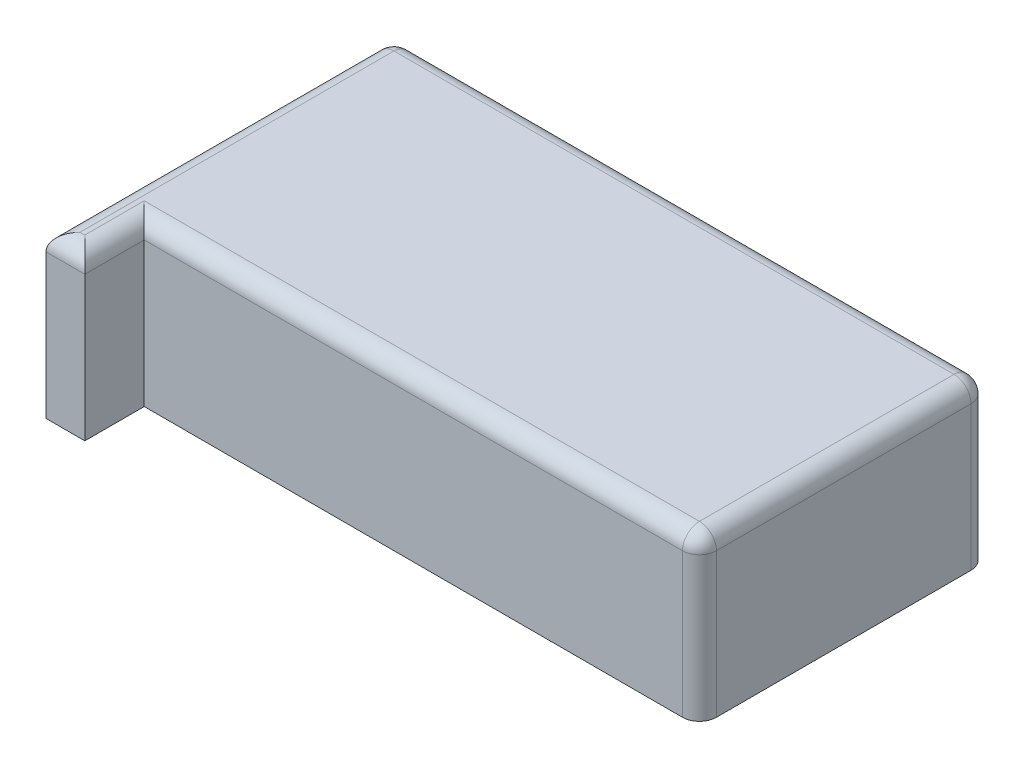
ISO-10303-21;
HEADER;
FILE_DESCRIPTION(('STEP AP214'),'2;1');
FILE_NAME('part.step','',(''),(''),'','','');
FILE_SCHEMA(('AUTOMOTIVE_DESIGN { 1 0 10303 214 1 1 1 1 }'));
ENDSEC;
DATA;
#1=APPLICATION_CONTEXT('core data for automotive mechanical design processes');
#2=APPLICATION_PROTOCOL_DEFINITION('international standard','automotive_design',2000,#1);
#3=PRODUCT_CONTEXT('',#1,'mechanical');
#4=PRODUCT('Part','Part','',(#3));
#5=PRODUCT_RELATED_PRODUCT_CATEGORY('part','',(#4));
#6=PRODUCT_DEFINITION_FORMATION('','',#4);
#7=PRODUCT_DEFINITION_CONTEXT('part definition',#1,'design');
#8=PRODUCT_DEFINITION('design','',#6,#7);
#9=PRODUCT_DEFINITION_SHAPE('','',#8);
#10=(LENGTH_UNIT() NAMED_UNIT(*) SI_UNIT(.MILLI.,.METRE.));
#11=(NAMED_UNIT(*) PLANE_ANGLE_UNIT() SI_UNIT($,.RADIAN.));
#12=(NAMED_UNIT(*) SI_UNIT($,.STERADIAN.) SOLID_ANGLE_UNIT());
#13=UNCERTAINTY_MEASURE_WITH_UNIT(LENGTH_MEASURE(1.E-05),#10,'distance_accuracy_value','');
#14=(GEOMETRIC_REPRESENTATION_CONTEXT(3) GLOBAL_UNCERTAINTY_ASSIGNED_CONTEXT((#13)) GLOBAL_UNIT_ASSIGNED_CONTEXT((#10,
#11,#12)) REPRESENTATION_CONTEXT('',''));
#15=CARTESIAN_POINT('',(0.,0.,0.));
#16=DIRECTION('',(0.,0.,1.));
#17=DIRECTION('',(1.,0.,0.));
#18=AXIS2_PLACEMENT_3D('',#15,#16,#17);
#19=CARTESIAN_POINT('',(0.,19.,0.));
#20=DIRECTION('',(0.,0.,-1.));
#21=DIRECTION('',(-1.,0.,0.));
#22=AXIS2_PLACEMENT_3D('',#19,#20,#21);
#23=PLANE('',#22);
#24=DIRECTION('',(1.,0.,0.));
#25=VECTOR('',#24,1.);
#26=CARTESIAN_POINT('',(0.,0.,0.));
#27=LINE('',#26,#25);
#28=CARTESIAN_POINT('',(4.57436202245276,0.,0.));
#29=VERTEX_POINT('',#28);
#30=CARTESIAN_POINT('',(68.,0.,0.));
#31=VERTEX_POINT('',#30);
#32=EDGE_CURVE('E147',#29,#31,#27,.T.);
#33=ORIENTED_EDGE('',*,*,#32,.T.);
#34=DIRECTION('',(0.,-1.,0.));
#35=VECTOR('',#34,1.);
#36=CARTESIAN_POINT('',(68.,19.,0.));
#37=LINE('',#36,#35);
#38=CARTESIAN_POINT('',(68.,17.,0.));
#39=VERTEX_POINT('',#38);
#40=EDGE_CURVE('E202',#31,#39,#37,.F.);
#41=ORIENTED_EDGE('',*,*,#40,.T.);
#42=DIRECTION('',(1.,0.,0.));
#43=VECTOR('',#42,1.);
#44=CARTESIAN_POINT('',(0.,17.,0.));
#45=LINE('',#44,#43);
#46=CARTESIAN_POINT('',(4.57436202245276,17.,0.));
#47=VERTEX_POINT('',#46);
#48=EDGE_CURVE('E175',#39,#47,#45,.F.);
#49=ORIENTED_EDGE('',*,*,#48,.T.);
#50=DIRECTION('',(0.,1.,0.));
#51=VECTOR('',#50,1.);
#52=CARTESIAN_POINT('',(4.57436202245276,19.,0.));
#53=LINE('',#52,#51);
#54=EDGE_CURVE('E138',#29,#47,#53,.T.);
#55=ORIENTED_EDGE('',*,*,#54,.F.);
#56=EDGE_LOOP('',(#33,#41,#49,#55));
#57=FACE_BOUND('',#56,.T.);
#58=ADVANCED_FACE('F38',(#57),#23,.F.);
#59=CARTESIAN_POINT('',(0.,19.,0.));
#60=DIRECTION('',(1.,0.,0.));
#61=DIRECTION('',(0.,0.,-1.));
#62=AXIS2_PLACEMENT_3D('',#59,#60,#61);
#63=PLANE('',#62);
#64=DIRECTION('',(0.,0.,1.));
#65=VECTOR('',#64,1.);
#66=CARTESIAN_POINT('',(0.,17.,0.));
#67=LINE('',#66,#65);
#68=CARTESIAN_POINT('',(0.,17.,7.));
#69=VERTEX_POINT('',#68);
#70=CARTESIAN_POINT('',(0.,17.,-32.));
#71=VERTEX_POINT('',#70);
#72=EDGE_CURVE('E178',#69,#71,#67,.F.);
#73=ORIENTED_EDGE('',*,*,#72,.T.);
#74=DIRECTION('',(0.,-1.,0.));
#75=VECTOR('',#74,1.);
#76=CARTESIAN_POINT('',(0.,19.,-32.));
#77=LINE('',#76,#75);
#78=CARTESIAN_POINT('',(0.,0.,-32.));
#79=VERTEX_POINT('',#78);
#80=EDGE_CURVE('E145',#71,#79,#77,.T.);
#81=ORIENTED_EDGE('',*,*,#80,.T.);
#82=DIRECTION('',(0.,0.,1.));
#83=VECTOR('',#82,1.);
#84=CARTESIAN_POINT('',(0.,0.,0.));
#85=LINE('',#84,#83);
#86=CARTESIAN_POINT('',(0.,0.,7.));
#87=VERTEX_POINT('',#86);
#88=EDGE_CURVE('E142',#79,#87,#85,.T.);
#89=ORIENTED_EDGE('',*,*,#88,.T.);
#90=DIRECTION('',(0.,-1.,0.));
#91=VECTOR('',#90,1.);
#92=CARTESIAN_POINT('',(0.,19.,7.));
#93=LINE('',#92,#91);
#94=EDGE_CURVE('E129',#69,#87,#93,.T.);
#95=ORIENTED_EDGE('',*,*,#94,.F.);
#96=EDGE_LOOP('',(#73,#81,#89,#95));
#97=FACE_BOUND('',#96,.T.);
#98=ADVANCED_FACE('F143',(#97),#63,.F.);
#99=CARTESIAN_POINT('',(70.,19.,0.));
#100=DIRECTION('',(-1.,0.,0.));
#101=DIRECTION('',(0.,0.,1.));
#102=AXIS2_PLACEMENT_3D('',#99,#100,#101);
#103=PLANE('',#102);
#104=DIRECTION('',(0.,0.,-1.));
#105=VECTOR('',#104,1.);
#106=CARTESIAN_POINT('',(70.,17.,0.));
#107=LINE('',#106,#105);
#108=CARTESIAN_POINT('',(70.,17.,-32.));
#109=VERTEX_POINT('',#108);
#110=CARTESIAN_POINT('',(70.,17.,-2.));
#111=VERTEX_POINT('',#110);
#112=EDGE_CURVE('E197',#109,#111,#107,.F.);
#113=ORIENTED_EDGE('',*,*,#112,.T.);
#114=DIRECTION('',(0.,-1.,0.));
#115=VECTOR('',#114,1.);
#116=CARTESIAN_POINT('',(70.,19.,-2.));
#117=LINE('',#116,#115);
#118=CARTESIAN_POINT('',(70.,0.,-2.));
#119=VERTEX_POINT('',#118);
#120=EDGE_CURVE('E199',#111,#119,#117,.T.);
#121=ORIENTED_EDGE('',*,*,#120,.T.);
#122=DIRECTION('',(0.,0.,-1.));
#123=VECTOR('',#122,1.);
#124=CARTESIAN_POINT('',(70.,0.,0.));
#125=LINE('',#124,#123);
#126=CARTESIAN_POINT('',(70.,0.,-32.));
#127=VERTEX_POINT('',#126);
#128=EDGE_CURVE('E162',#119,#127,#125,.T.);
#129=ORIENTED_EDGE('',*,*,#128,.T.);
#130=DIRECTION('',(0.,-1.,0.));
#131=VECTOR('',#130,1.);
#132=CARTESIAN_POINT('',(70.,19.,-32.));
#133=LINE('',#132,#131);
#134=EDGE_CURVE('E195',#127,#109,#133,.F.);
#135=ORIENTED_EDGE('',*,*,#134,.T.);
#136=EDGE_LOOP('',(#113,#121,#129,#135));
#137=FACE_BOUND('',#136,.T.);
#138=ADVANCED_FACE('F288',(#137),#103,.F.);
#139=CARTESIAN_POINT('',(0.,19.,-34.));
#140=DIRECTION('',(0.,0.,1.));
#141=DIRECTION('',(1.,0.,0.));
#142=AXIS2_PLACEMENT_3D('',#139,#140,#141);
#143=PLANE('',#142);
#144=DIRECTION('',(-1.,0.,0.));
#145=VECTOR('',#144,1.);
#146=CARTESIAN_POINT('',(0.,0.,-34.));
#147=LINE('',#146,#145);
#148=CARTESIAN_POINT('',(68.,0.,-34.));
#149=VERTEX_POINT('',#148);
#150=CARTESIAN_POINT('',(2.,0.,-34.));
#151=VERTEX_POINT('',#150);
#152=EDGE_CURVE('E165',#149,#151,#147,.T.);
#153=ORIENTED_EDGE('',*,*,#152,.T.);
#154=DIRECTION('',(0.,-1.,0.));
#155=VECTOR('',#154,1.);
#156=CARTESIAN_POINT('',(2.,19.,-34.));
#157=LINE('',#156,#155);
#158=CARTESIAN_POINT('',(2.,17.,-34.));
#159=VERTEX_POINT('',#158);
#160=EDGE_CURVE('E189',#151,#159,#157,.F.);
#161=ORIENTED_EDGE('',*,*,#160,.T.);
#162=DIRECTION('',(-1.,0.,0.));
#163=VECTOR('',#162,1.);
#164=CARTESIAN_POINT('',(0.,17.,-34.));
#165=LINE('',#164,#163);
#166=CARTESIAN_POINT('',(68.,17.,-34.));
#167=VERTEX_POINT('',#166);
#168=EDGE_CURVE('E172',#159,#167,#165,.F.);
#169=ORIENTED_EDGE('',*,*,#168,.T.);
#170=DIRECTION('',(0.,-1.,0.));
#171=VECTOR('',#170,1.);
#172=CARTESIAN_POINT('',(68.,19.,-34.));
#173=LINE('',#172,#171);
#174=EDGE_CURVE('E187',#167,#149,#173,.T.);
#175=ORIENTED_EDGE('',*,*,#174,.T.);
#176=EDGE_LOOP('',(#153,#161,#169,#175));
#177=FACE_BOUND('',#176,.T.);
#178=ADVANCED_FACE('F249',(#177),#143,.F.);
#179=CARTESIAN_POINT('',(0.,19.,0.));
#180=DIRECTION('',(0.,-1.,0.));
#181=DIRECTION('',(0.,0.,-1.));
#182=AXIS2_PLACEMENT_3D('',#179,#180,#181);
#183=PLANE('',#182);
#184=DIRECTION('',(0.,0.,-1.));
#185=VECTOR('',#184,1.);
#186=CARTESIAN_POINT('',(2.57436202245276,19.,0.));
#187=LINE('',#186,#185);
#188=CARTESIAN_POINT('',(2.57436202245276,19.,5.));
#189=VERTEX_POINT('',#188);
#190=CARTESIAN_POINT('',(2.57436202245276,19.,-2.));
#191=VERTEX_POINT('',#190);
#192=EDGE_CURVE('E212',#189,#191,#187,.T.);
#193=ORIENTED_EDGE('',*,*,#192,.T.);
#194=DIRECTION('',(1.,0.,0.));
#195=VECTOR('',#194,1.);
#196=CARTESIAN_POINT('',(0.,19.,-2.));
#197=LINE('',#196,#195);
#198=CARTESIAN_POINT('',(68.,19.,-2.));
#199=VERTEX_POINT('',#198);
#200=EDGE_CURVE('E62',#191,#199,#197,.T.);
#201=ORIENTED_EDGE('',*,*,#200,.T.);
#202=DIRECTION('',(0.,0.,-1.));
#203=VECTOR('',#202,1.);
#204=CARTESIAN_POINT('',(68.,19.,0.));
#205=LINE('',#204,#203);
#206=CARTESIAN_POINT('',(68.,19.,-32.));
#207=VERTEX_POINT('',#206);
#208=EDGE_CURVE('E206',#199,#207,#205,.T.);
#209=ORIENTED_EDGE('',*,*,#208,.T.);
#210=DIRECTION('',(-1.,0.,0.));
#211=VECTOR('',#210,1.);
#212=CARTESIAN_POINT('',(0.,19.,-32.));
#213=LINE('',#212,#211);
#214=CARTESIAN_POINT('',(2.,19.,-32.));
#215=VERTEX_POINT('',#214);
#216=EDGE_CURVE('E169',#207,#215,#213,.T.);
#217=ORIENTED_EDGE('',*,*,#216,.T.);
#218=DIRECTION('',(0.,0.,1.));
#219=VECTOR('',#218,1.);
#220=CARTESIAN_POINT('',(2.,19.,0.));
#221=LINE('',#220,#219);
#222=CARTESIAN_POINT('',(2.,19.,5.));
#223=VERTEX_POINT('',#222);
#224=EDGE_CURVE('E208',#215,#223,#221,.T.);
#225=ORIENTED_EDGE('',*,*,#224,.T.);
#226=DIRECTION('',(-1.,0.,0.));
#227=VECTOR('',#226,1.);
#228=CARTESIAN_POINT('',(4.57436202245276,19.,5.));
#229=LINE('',#228,#227);
#230=EDGE_CURVE('E210',#223,#189,#229,.F.);
#231=ORIENTED_EDGE('',*,*,#230,.T.);
#232=EDGE_LOOP('',(#193,#201,#209,#217,#225,#231));
#233=FACE_BOUND('',#232,.T.);
#234=ADVANCED_FACE('F269',(#233),#183,.F.);
#235=CARTESIAN_POINT('',(0.,0.,0.));
#236=DIRECTION('',(0.,-1.,0.));
#237=DIRECTION('',(0.,0.,-1.));
#238=AXIS2_PLACEMENT_3D('',#235,#236,#237);
#239=PLANE('',#238);
#240=ORIENTED_EDGE('',*,*,#88,.F.);
#241=CARTESIAN_POINT('',(2.,0.,-32.));
#242=DIRECTION('',(0.,-1.,0.));
#243=DIRECTION('',(0.,0.,-1.));
#244=AXIS2_PLACEMENT_3D('',#241,#242,#243);
#245=CIRCLE('',#244,2.);
#246=EDGE_CURVE('E185',#79,#151,#245,.T.);
#247=ORIENTED_EDGE('',*,*,#246,.T.);
#248=ORIENTED_EDGE('',*,*,#152,.F.);
#249=CARTESIAN_POINT('',(68.,0.,-32.));
#250=DIRECTION('',(0.,-1.,0.));
#251=DIRECTION('',(0.,0.,-1.));
#252=AXIS2_PLACEMENT_3D('',#249,#250,#251);
#253=CIRCLE('',#252,2.);
#254=EDGE_CURVE('E181',#149,#127,#253,.T.);
#255=ORIENTED_EDGE('',*,*,#254,.T.);
#256=ORIENTED_EDGE('',*,*,#128,.F.);
#257=CARTESIAN_POINT('',(68.,0.,-2.));
#258=DIRECTION('',(0.,-1.,0.));
#259=DIRECTION('',(0.,0.,-1.));
#260=AXIS2_PLACEMENT_3D('',#257,#258,#259);
#261=CIRCLE('',#260,2.);
#262=EDGE_CURVE('E183',#119,#31,#261,.T.);
#263=ORIENTED_EDGE('',*,*,#262,.T.);
#264=ORIENTED_EDGE('',*,*,#32,.F.);
#265=DIRECTION('',(0.,0.,-1.));
#266=VECTOR('',#265,1.);
#267=CARTESIAN_POINT('',(4.57436202245276,0.,7.));
#268=LINE('',#267,#266);
#269=CARTESIAN_POINT('',(4.57436202245276,0.,7.));
#270=VERTEX_POINT('',#269);
#271=EDGE_CURVE('E148',#270,#29,#268,.T.);
#272=ORIENTED_EDGE('',*,*,#271,.F.);
#273=DIRECTION('',(1.,0.,0.));
#274=VECTOR('',#273,1.);
#275=CARTESIAN_POINT('',(0.,0.,7.));
#276=LINE('',#275,#274);
#277=EDGE_CURVE('E133',#87,#270,#276,.T.);
#278=ORIENTED_EDGE('',*,*,#277,.F.);
#279=EDGE_LOOP('',(#240,#247,#248,#255,#256,#263,#264,#272,#278));
#280=FACE_BOUND('',#279,.T.);
#281=ADVANCED_FACE('F150',(#280),#239,.T.);
#282=CARTESIAN_POINT('',(4.57436202245276,19.,7.));
#283=DIRECTION('',(-1.,0.,0.));
#284=DIRECTION('',(0.,0.,1.));
#285=AXIS2_PLACEMENT_3D('',#282,#283,#284);
#286=PLANE('',#285);
#287=ORIENTED_EDGE('',*,*,#54,.T.);
#288=DIRECTION('',(0.,0.,-1.));
#289=VECTOR('',#288,1.);
#290=CARTESIAN_POINT('',(4.57436202245276,17.,7.));
#291=LINE('',#290,#289);
#292=CARTESIAN_POINT('',(4.57436202245276,17.,7.));
#293=VERTEX_POINT('',#292);
#294=EDGE_CURVE('E55',#47,#293,#291,.F.);
#295=ORIENTED_EDGE('',*,*,#294,.T.);
#296=DIRECTION('',(0.,1.,0.));
#297=VECTOR('',#296,1.);
#298=CARTESIAN_POINT('',(4.57436202245276,19.,7.));
#299=LINE('',#298,#297);
#300=EDGE_CURVE('E153',#270,#293,#299,.T.);
#301=ORIENTED_EDGE('',*,*,#300,.F.);
#302=ORIENTED_EDGE('',*,*,#271,.T.);
#303=EDGE_LOOP('',(#287,#295,#301,#302));
#304=FACE_BOUND('',#303,.T.);
#305=ADVANCED_FACE('F291',(#304),#286,.F.);
#306=CARTESIAN_POINT('',(0.,0.,7.));
#307=DIRECTION('',(0.,0.,1.));
#308=DIRECTION('',(1.,0.,0.));
#309=AXIS2_PLACEMENT_3D('',#306,#307,#308);
#310=PLANE('',#309);
#311=ORIENTED_EDGE('',*,*,#300,.T.);
#312=DIRECTION('',(-1.,0.,0.));
#313=VECTOR('',#312,1.);
#314=CARTESIAN_POINT('',(0.,17.,7.));
#315=LINE('',#314,#313);
#316=EDGE_CURVE('E47',#293,#69,#315,.T.);
#317=ORIENTED_EDGE('',*,*,#316,.T.);
#318=ORIENTED_EDGE('',*,*,#94,.T.);
#319=ORIENTED_EDGE('',*,*,#277,.T.);
#320=EDGE_LOOP('',(#311,#317,#318,#319));
#321=FACE_BOUND('',#320,.T.);
#322=ADVANCED_FACE('F131',(#321),#310,.T.);
#323=CARTESIAN_POINT('',(0.,17.,-32.));
#324=DIRECTION('',(-1.,0.,0.));
#325=DIRECTION('',(0.,0.,1.));
#326=AXIS2_PLACEMENT_3D('',#323,#324,#325);
#327=CYLINDRICAL_SURFACE('',#326,2.);
#328=ORIENTED_EDGE('',*,*,#168,.F.);
#329=CARTESIAN_POINT('',(2.,17.,-32.));
#330=DIRECTION('',(-1.,0.,0.));
#331=DIRECTION('',(0.,0.,1.));
#332=AXIS2_PLACEMENT_3D('',#329,#330,#331);
#333=CIRCLE('',#332,2.);
#334=EDGE_CURVE('E193',#159,#215,#333,.F.);
#335=ORIENTED_EDGE('',*,*,#334,.T.);
#336=ORIENTED_EDGE('',*,*,#216,.F.);
#337=CARTESIAN_POINT('',(68.,17.,-32.));
#338=DIRECTION('',(-1.,0.,0.));
#339=DIRECTION('',(0.,0.,1.));
#340=AXIS2_PLACEMENT_3D('',#337,#338,#339);
#341=CIRCLE('',#340,2.);
#342=EDGE_CURVE('E191',#207,#167,#341,.T.);
#343=ORIENTED_EDGE('',*,*,#342,.T.);
#344=EDGE_LOOP('',(#328,#335,#336,#343));
#345=FACE_BOUND('',#344,.T.);
#346=ADVANCED_FACE('F258',(#345),#327,.T.);
#347=CARTESIAN_POINT('',(0.,17.,-2.));
#348=DIRECTION('',(1.,0.,0.));
#349=DIRECTION('',(0.,0.,-1.));
#350=AXIS2_PLACEMENT_3D('',#347,#348,#349);
#351=CYLINDRICAL_SURFACE('',#350,2.);
#352=ORIENTED_EDGE('',*,*,#48,.F.);
#353=CARTESIAN_POINT('',(68.,17.,-2.));
#354=DIRECTION('',(1.,0.,0.));
#355=DIRECTION('',(0.,0.,-1.));
#356=AXIS2_PLACEMENT_3D('',#353,#354,#355);
#357=CIRCLE('',#356,2.);
#358=EDGE_CURVE('E204',#39,#199,#357,.F.);
#359=ORIENTED_EDGE('',*,*,#358,.T.);
#360=ORIENTED_EDGE('',*,*,#200,.F.);
#361=CARTESIAN_POINT('',(2.57436202245276,17.,-2.));
#362=DIRECTION('',(0.707106781186547,0.,-0.707106781186547));
#363=DIRECTION('',(-0.707106781186547,0.,-0.707106781186547));
#364=AXIS2_PLACEMENT_3D('',#361,#362,#363);
#365=ELLIPSE('',#364,2.82842712474619,2.);
#366=EDGE_CURVE('E11',#191,#47,#365,.T.);
#367=ORIENTED_EDGE('',*,*,#366,.T.);
#368=EDGE_LOOP('',(#352,#359,#360,#367));
#369=FACE_BOUND('',#368,.T.);
#370=ADVANCED_FACE('F312',(#369),#351,.T.);
#371=CARTESIAN_POINT('',(2.57436202245276,17.,0.));
#372=DIRECTION('',(0.,0.,-1.));
#373=DIRECTION('',(-1.,0.,0.));
#374=AXIS2_PLACEMENT_3D('',#371,#372,#373);
#375=CYLINDRICAL_SURFACE('',#374,2.);
#376=ORIENTED_EDGE('',*,*,#366,.F.);
#377=ORIENTED_EDGE('',*,*,#192,.F.);
#378=CARTESIAN_POINT('',(2.57436202245276,17.,5.));
#379=DIRECTION('',(0.707106781186547,0.,-0.707106781186547));
#380=DIRECTION('',(0.707106781186547,0.,0.707106781186547));
#381=AXIS2_PLACEMENT_3D('',#378,#379,#380);
#382=ELLIPSE('',#381,2.82842712474619,2.);
#383=EDGE_CURVE('E158',#293,#189,#382,.F.);
#384=ORIENTED_EDGE('',*,*,#383,.F.);
#385=ORIENTED_EDGE('',*,*,#294,.F.);
#386=EDGE_LOOP('',(#376,#377,#384,#385));
#387=FACE_BOUND('',#386,.T.);
#388=ADVANCED_FACE('F276',(#387),#375,.T.);
#389=CARTESIAN_POINT('',(0.,17.,5.));
#390=DIRECTION('',(1.,0.,0.));
#391=DIRECTION('',(0.,0.,-1.));
#392=AXIS2_PLACEMENT_3D('',#389,#390,#391);
#393=CYLINDRICAL_SURFACE('',#392,2.);
#394=ORIENTED_EDGE('',*,*,#383,.T.);
#395=ORIENTED_EDGE('',*,*,#230,.F.);
#396=CARTESIAN_POINT('',(2.,17.,5.));
#397=DIRECTION('',(0.707106781186547,0.,0.707106781186547));
#398=DIRECTION('',(-0.707106781186547,0.,0.707106781186547));
#399=AXIS2_PLACEMENT_3D('',#396,#397,#398);
#400=ELLIPSE('',#399,2.82842712474619,2.);
#401=EDGE_CURVE('E222',#69,#223,#400,.F.);
#402=ORIENTED_EDGE('',*,*,#401,.F.);
#403=ORIENTED_EDGE('',*,*,#316,.F.);
#404=EDGE_LOOP('',(#394,#395,#402,#403));
#405=FACE_BOUND('',#404,.T.);
#406=ADVANCED_FACE('F272',(#405),#393,.T.);
#407=CARTESIAN_POINT('',(2.,17.,0.));
#408=DIRECTION('',(0.,0.,1.));
#409=DIRECTION('',(1.,0.,0.));
#410=AXIS2_PLACEMENT_3D('',#407,#408,#409);
#411=CYLINDRICAL_SURFACE('',#410,2.);
#412=ORIENTED_EDGE('',*,*,#401,.T.);
#413=ORIENTED_EDGE('',*,*,#224,.F.);
#414=CARTESIAN_POINT('',(2.,17.,-32.));
#415=DIRECTION('',(0.,0.,-1.));
#416=DIRECTION('',(-1.,0.,0.));
#417=AXIS2_PLACEMENT_3D('',#414,#415,#416);
#418=CIRCLE('',#417,2.);
#419=EDGE_CURVE('E219',#71,#215,#418,.T.);
#420=ORIENTED_EDGE('',*,*,#419,.F.);
#421=ORIENTED_EDGE('',*,*,#72,.F.);
#422=EDGE_LOOP('',(#412,#413,#420,#421));
#423=FACE_BOUND('',#422,.T.);
#424=ADVANCED_FACE('F266',(#423),#411,.T.);
#425=CARTESIAN_POINT('',(2.,17.,-32.));
#426=DIRECTION('',(1.,0.,0.));
#427=DIRECTION('',(0.,0.,-1.));
#428=AXIS2_PLACEMENT_3D('',#425,#426,#427);
#429=SPHERICAL_SURFACE('',#428,2.);
#430=ORIENTED_EDGE('',*,*,#419,.T.);
#431=ORIENTED_EDGE('',*,*,#334,.F.);
#432=CARTESIAN_POINT('',(2.,17.,-32.));
#433=DIRECTION('',(0.,-1.,0.));
#434=DIRECTION('',(0.,0.,-1.));
#435=AXIS2_PLACEMENT_3D('',#432,#433,#434);
#436=CIRCLE('',#435,2.);
#437=EDGE_CURVE('E216',#71,#159,#436,.T.);
#438=ORIENTED_EDGE('',*,*,#437,.F.);
#439=EDGE_LOOP('',(#430,#431,#438));
#440=FACE_BOUND('',#439,.T.);
#441=ADVANCED_FACE('F261',(#440),#429,.T.);
#442=CARTESIAN_POINT('',(2.,19.,-32.));
#443=DIRECTION('',(0.,-1.,0.));
#444=DIRECTION('',(0.,0.,-1.));
#445=AXIS2_PLACEMENT_3D('',#442,#443,#444);
#446=CYLINDRICAL_SURFACE('',#445,2.);
#447=ORIENTED_EDGE('',*,*,#437,.T.);
#448=ORIENTED_EDGE('',*,*,#160,.F.);
#449=ORIENTED_EDGE('',*,*,#246,.F.);
#450=ORIENTED_EDGE('',*,*,#80,.F.);
#451=EDGE_LOOP('',(#447,#448,#449,#450));
#452=FACE_BOUND('',#451,.T.);
#453=ADVANCED_FACE('F254',(#452),#446,.T.);
#454=CARTESIAN_POINT('',(68.,19.,-32.));
#455=DIRECTION('',(0.,-1.,0.));
#456=DIRECTION('',(0.,0.,-1.));
#457=AXIS2_PLACEMENT_3D('',#454,#455,#456);
#458=CYLINDRICAL_SURFACE('',#457,2.);
#459=ORIENTED_EDGE('',*,*,#254,.F.);
#460=ORIENTED_EDGE('',*,*,#174,.F.);
#461=CARTESIAN_POINT('',(68.,17.,-32.));
#462=DIRECTION('',(0.,1.,0.));
#463=DIRECTION('',(0.,0.,1.));
#464=AXIS2_PLACEMENT_3D('',#461,#462,#463);
#465=CIRCLE('',#464,2.);
#466=EDGE_CURVE('E42',#109,#167,#465,.T.);
#467=ORIENTED_EDGE('',*,*,#466,.F.);
#468=ORIENTED_EDGE('',*,*,#134,.F.);
#469=EDGE_LOOP('',(#459,#460,#467,#468));
#470=FACE_BOUND('',#469,.T.);
#471=ADVANCED_FACE('F40',(#470),#458,.T.);
#472=CARTESIAN_POINT('',(68.,17.,-32.));
#473=DIRECTION('',(-1.,0.,0.));
#474=DIRECTION('',(0.,0.,1.));
#475=AXIS2_PLACEMENT_3D('',#472,#473,#474);
#476=SPHERICAL_SURFACE('',#475,2.);
#477=ORIENTED_EDGE('',*,*,#466,.T.);
#478=ORIENTED_EDGE('',*,*,#342,.F.);
#479=CARTESIAN_POINT('',(68.,17.,-32.));
#480=DIRECTION('',(0.,0.,1.));
#481=DIRECTION('',(1.,0.,0.));
#482=AXIS2_PLACEMENT_3D('',#479,#480,#481);
#483=CIRCLE('',#482,2.);
#484=EDGE_CURVE('E232',#109,#207,#483,.T.);
#485=ORIENTED_EDGE('',*,*,#484,.F.);
#486=EDGE_LOOP('',(#477,#478,#485));
#487=FACE_BOUND('',#486,.T.);
#488=ADVANCED_FACE('F242',(#487),#476,.T.);
#489=CARTESIAN_POINT('',(68.,17.,0.));
#490=DIRECTION('',(0.,0.,-1.));
#491=DIRECTION('',(-1.,0.,0.));
#492=AXIS2_PLACEMENT_3D('',#489,#490,#491);
#493=CYLINDRICAL_SURFACE('',#492,2.);
#494=ORIENTED_EDGE('',*,*,#484,.T.);
#495=ORIENTED_EDGE('',*,*,#208,.F.);
#496=CARTESIAN_POINT('',(68.,17.,-2.));
#497=DIRECTION('',(0.,0.,1.));
#498=DIRECTION('',(1.,0.,0.));
#499=AXIS2_PLACEMENT_3D('',#496,#497,#498);
#500=CIRCLE('',#499,2.);
#501=EDGE_CURVE('E230',#111,#199,#500,.T.);
#502=ORIENTED_EDGE('',*,*,#501,.F.);
#503=ORIENTED_EDGE('',*,*,#112,.F.);
#504=EDGE_LOOP('',(#494,#495,#502,#503));
#505=FACE_BOUND('',#504,.T.);
#506=ADVANCED_FACE('F278',(#505),#493,.T.);
#507=CARTESIAN_POINT('',(68.,17.,-2.));
#508=DIRECTION('',(-1.,0.,0.));
#509=DIRECTION('',(0.,0.,1.));
#510=AXIS2_PLACEMENT_3D('',#507,#508,#509);
#511=SPHERICAL_SURFACE('',#510,2.);
#512=ORIENTED_EDGE('',*,*,#501,.T.);
#513=ORIENTED_EDGE('',*,*,#358,.F.);
#514=CARTESIAN_POINT('',(68.,17.,-2.));
#515=DIRECTION('',(0.,-1.,0.));
#516=DIRECTION('',(0.,0.,-1.));
#517=AXIS2_PLACEMENT_3D('',#514,#515,#516);
#518=CIRCLE('',#517,2.);
#519=EDGE_CURVE('E227',#111,#39,#518,.T.);
#520=ORIENTED_EDGE('',*,*,#519,.F.);
#521=EDGE_LOOP('',(#512,#513,#520));
#522=FACE_BOUND('',#521,.T.);
#523=ADVANCED_FACE('F282',(#522),#511,.T.);
#524=CARTESIAN_POINT('',(68.,19.,-2.));
#525=DIRECTION('',(0.,-1.,0.));
#526=DIRECTION('',(0.,0.,-1.));
#527=AXIS2_PLACEMENT_3D('',#524,#525,#526);
#528=CYLINDRICAL_SURFACE('',#527,2.);
#529=ORIENTED_EDGE('',*,*,#519,.T.);
#530=ORIENTED_EDGE('',*,*,#40,.F.);
#531=ORIENTED_EDGE('',*,*,#262,.F.);
#532=ORIENTED_EDGE('',*,*,#120,.F.);
#533=EDGE_LOOP('',(#529,#530,#531,#532));
#534=FACE_BOUND('',#533,.T.);
#535=ADVANCED_FACE('F286',(#534),#528,.T.);
#536=CLOSED_SHELL('',(#58,#98,#138,#178,#234,#281,#305,#322,#346,#370,#388,#406,#424,#441,#453,
#471,#488,#506,#523,#535));
#537=MANIFOLD_SOLID_BREP('B2',#536);
#538=ADVANCED_BREP_SHAPE_REPRESENTATION('',(#18,#537),#14);
#539=SHAPE_DEFINITION_REPRESENTATION(#9,#538);
ENDSEC;
END-ISO-10303-21;
